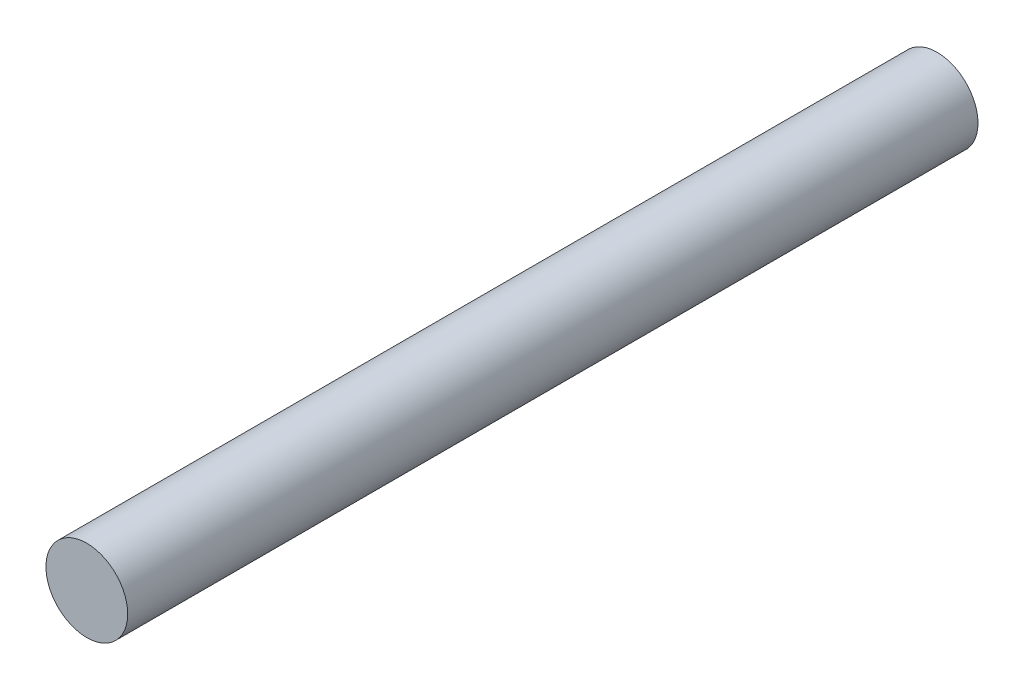
ISO-10303-21;
HEADER;
FILE_DESCRIPTION(('STEP AP214'),'2;1');
FILE_NAME('part.step','',(''),(''),'','','');
FILE_SCHEMA(('AUTOMOTIVE_DESIGN { 1 0 10303 214 1 1 1 1 }'));
ENDSEC;
DATA;
#1=APPLICATION_CONTEXT('core data for automotive mechanical design processes');
#2=APPLICATION_PROTOCOL_DEFINITION('international standard','automotive_design',2000,#1);
#3=PRODUCT_CONTEXT('',#1,'mechanical');
#4=PRODUCT('Part','Part','',(#3));
#5=PRODUCT_RELATED_PRODUCT_CATEGORY('part','',(#4));
#6=PRODUCT_DEFINITION_FORMATION('','',#4);
#7=PRODUCT_DEFINITION_CONTEXT('part definition',#1,'design');
#8=PRODUCT_DEFINITION('design','',#6,#7);
#9=PRODUCT_DEFINITION_SHAPE('','',#8);
#10=(LENGTH_UNIT() NAMED_UNIT(*) SI_UNIT(.MILLI.,.METRE.));
#11=(NAMED_UNIT(*) PLANE_ANGLE_UNIT() SI_UNIT($,.RADIAN.));
#12=(NAMED_UNIT(*) SI_UNIT($,.STERADIAN.) SOLID_ANGLE_UNIT());
#13=UNCERTAINTY_MEASURE_WITH_UNIT(LENGTH_MEASURE(1.E-05),#10,'distance_accuracy_value','');
#14=(GEOMETRIC_REPRESENTATION_CONTEXT(3) GLOBAL_UNCERTAINTY_ASSIGNED_CONTEXT((#13)) GLOBAL_UNIT_ASSIGNED_CONTEXT((#10,
#11,#12)) REPRESENTATION_CONTEXT('',''));
#15=CARTESIAN_POINT('',(0.,0.,0.));
#16=DIRECTION('',(0.,0.,1.));
#17=DIRECTION('',(1.,0.,0.));
#18=AXIS2_PLACEMENT_3D('',#15,#16,#17);
#19=CARTESIAN_POINT('',(0.,0.,330.2));
#20=DIRECTION('',(0.,0.,-1.));
#21=DIRECTION('',(-1.,0.,0.));
#22=AXIS2_PLACEMENT_3D('',#19,#20,#21);
#23=CYLINDRICAL_SURFACE('',#22,15.875);
#24=CARTESIAN_POINT('',(0.,0.,330.2));
#25=DIRECTION('',(0.,0.,1.));
#26=DIRECTION('',(1.,0.,0.));
#27=AXIS2_PLACEMENT_3D('',#24,#25,#26);
#28=CIRCLE('',#27,15.875);
#29=CARTESIAN_POINT('',(15.875,0.,330.2));
#30=VERTEX_POINT('',#29);
#31=EDGE_CURVE('E10',#30,#30,#28,.T.);
#32=ORIENTED_EDGE('',*,*,#31,.F.);
#33=EDGE_LOOP('',(#32));
#34=FACE_BOUND('',#33,.T.);
#35=CARTESIAN_POINT('',(0.,0.,0.));
#36=DIRECTION('',(0.,0.,1.));
#37=DIRECTION('',(1.,0.,0.));
#38=AXIS2_PLACEMENT_3D('',#35,#36,#37);
#39=CIRCLE('',#38,15.875);
#40=CARTESIAN_POINT('',(15.875,0.,0.));
#41=VERTEX_POINT('',#40);
#42=EDGE_CURVE('E33',#41,#41,#39,.T.);
#43=ORIENTED_EDGE('',*,*,#42,.T.);
#44=EDGE_LOOP('',(#43));
#45=FACE_BOUND('',#44,.T.);
#46=ADVANCED_FACE('F30',(#34,#45),#23,.T.);
#47=CARTESIAN_POINT('',(0.,0.,330.2));
#48=DIRECTION('',(0.,0.,1.));
#49=DIRECTION('',(1.,0.,0.));
#50=AXIS2_PLACEMENT_3D('',#47,#48,#49);
#51=PLANE('',#50);
#52=ORIENTED_EDGE('',*,*,#31,.T.);
#53=EDGE_LOOP('',(#52));
#54=FACE_BOUND('',#53,.T.);
#55=ADVANCED_FACE('F45',(#54),#51,.T.);
#56=CARTESIAN_POINT('',(0.,0.,0.));
#57=DIRECTION('',(0.,0.,1.));
#58=DIRECTION('',(1.,0.,0.));
#59=AXIS2_PLACEMENT_3D('',#56,#57,#58);
#60=PLANE('',#59);
#61=ORIENTED_EDGE('',*,*,#42,.F.);
#62=EDGE_LOOP('',(#61));
#63=FACE_BOUND('',#62,.T.);
#64=ADVANCED_FACE('F43',(#63),#60,.F.);
#65=CLOSED_SHELL('',(#46,#55,#64));
#66=MANIFOLD_SOLID_BREP('B2',#65);
#67=ADVANCED_BREP_SHAPE_REPRESENTATION('',(#18,#66),#14);
#68=SHAPE_DEFINITION_REPRESENTATION(#9,#67);
ENDSEC;
END-ISO-10303-21;
